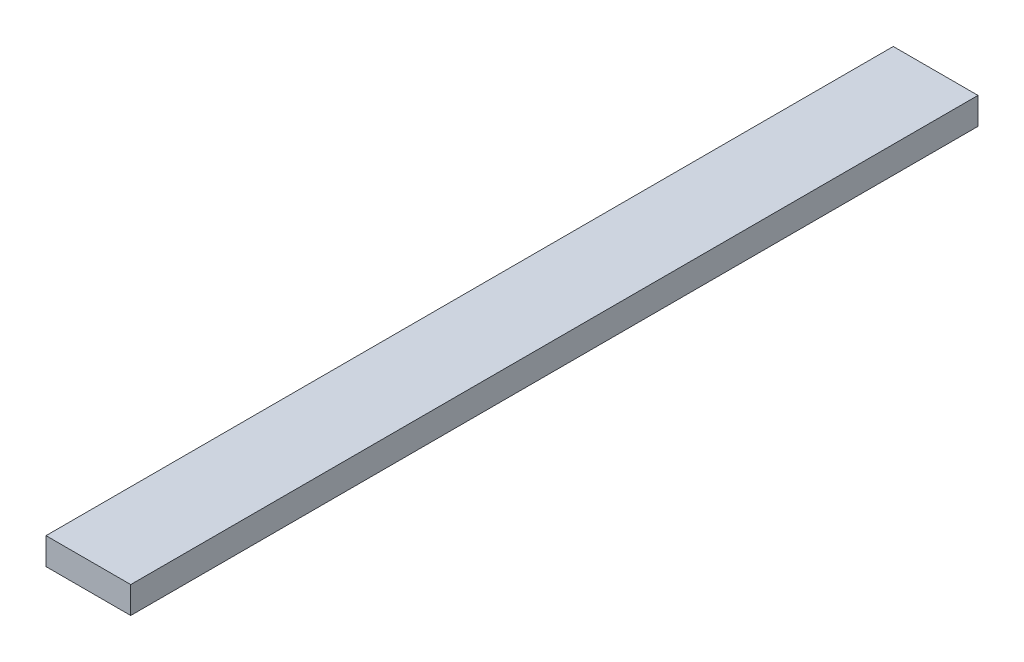
ISO-10303-21;
HEADER;
FILE_DESCRIPTION(('STEP AP214'),'2;1');
FILE_NAME('part.step','',(''),(''),'','','');
FILE_SCHEMA(('AUTOMOTIVE_DESIGN { 1 0 10303 214 1 1 1 1 }'));
ENDSEC;
DATA;
#1=APPLICATION_CONTEXT('core data for automotive mechanical design processes');
#2=APPLICATION_PROTOCOL_DEFINITION('international standard','automotive_design',2000,#1);
#3=PRODUCT_CONTEXT('',#1,'mechanical');
#4=PRODUCT('Part','Part','',(#3));
#5=PRODUCT_RELATED_PRODUCT_CATEGORY('part','',(#4));
#6=PRODUCT_DEFINITION_FORMATION('','',#4);
#7=PRODUCT_DEFINITION_CONTEXT('part definition',#1,'design');
#8=PRODUCT_DEFINITION('design','',#6,#7);
#9=PRODUCT_DEFINITION_SHAPE('','',#8);
#10=(LENGTH_UNIT() NAMED_UNIT(*) SI_UNIT(.MILLI.,.METRE.));
#11=(NAMED_UNIT(*) PLANE_ANGLE_UNIT() SI_UNIT($,.RADIAN.));
#12=(NAMED_UNIT(*) SI_UNIT($,.STERADIAN.) SOLID_ANGLE_UNIT());
#13=UNCERTAINTY_MEASURE_WITH_UNIT(LENGTH_MEASURE(1.E-05),#10,'distance_accuracy_value','');
#14=(GEOMETRIC_REPRESENTATION_CONTEXT(3) GLOBAL_UNCERTAINTY_ASSIGNED_CONTEXT((#13)) GLOBAL_UNIT_ASSIGNED_CONTEXT((#10,
#11,#12)) REPRESENTATION_CONTEXT('',''));
#15=CARTESIAN_POINT('',(0.,0.,0.));
#16=DIRECTION('',(0.,0.,1.));
#17=DIRECTION('',(1.,0.,0.));
#18=AXIS2_PLACEMENT_3D('',#15,#16,#17);
#19=CARTESIAN_POINT('',(0.,0.,600.));
#20=DIRECTION('',(1.,0.,0.));
#21=DIRECTION('',(0.,0.,-1.));
#22=AXIS2_PLACEMENT_3D('',#19,#20,#21);
#23=PLANE('',#22);
#24=DIRECTION('',(0.,-1.,0.));
#25=VECTOR('',#24,1.);
#26=CARTESIAN_POINT('',(0.,0.,0.));
#27=LINE('',#26,#25);
#28=CARTESIAN_POINT('',(0.,19.,0.));
#29=VERTEX_POINT('',#28);
#30=CARTESIAN_POINT('',(0.,0.,0.));
#31=VERTEX_POINT('',#30);
#32=EDGE_CURVE('E96',#29,#31,#27,.T.);
#33=ORIENTED_EDGE('',*,*,#32,.T.);
#34=DIRECTION('',(0.,0.,-1.));
#35=VECTOR('',#34,1.);
#36=CARTESIAN_POINT('',(0.,0.,600.));
#37=LINE('',#36,#35);
#38=CARTESIAN_POINT('',(0.,0.,600.));
#39=VERTEX_POINT('',#38);
#40=EDGE_CURVE('E11',#39,#31,#37,.T.);
#41=ORIENTED_EDGE('',*,*,#40,.F.);
#42=DIRECTION('',(0.,-1.,0.));
#43=VECTOR('',#42,1.);
#44=CARTESIAN_POINT('',(0.,0.,600.));
#45=LINE('',#44,#43);
#46=CARTESIAN_POINT('',(0.,19.,600.));
#47=VERTEX_POINT('',#46);
#48=EDGE_CURVE('E84',#47,#39,#45,.T.);
#49=ORIENTED_EDGE('',*,*,#48,.F.);
#50=DIRECTION('',(0.,0.,-1.));
#51=VECTOR('',#50,1.);
#52=CARTESIAN_POINT('',(0.,19.,600.));
#53=LINE('',#52,#51);
#54=EDGE_CURVE('E92',#47,#29,#53,.T.);
#55=ORIENTED_EDGE('',*,*,#54,.T.);
#56=EDGE_LOOP('',(#33,#41,#49,#55));
#57=FACE_BOUND('',#56,.T.);
#58=ADVANCED_FACE('F33',(#57),#23,.F.);
#59=CARTESIAN_POINT('',(0.,0.,600.));
#60=DIRECTION('',(0.,1.,0.));
#61=DIRECTION('',(0.,0.,1.));
#62=AXIS2_PLACEMENT_3D('',#59,#60,#61);
#63=PLANE('',#62);
#64=CARTESIAN_POINT('',(38.,0.,8.00000000000001));
#65=DIRECTION('',(0.,-1.,0.));
#66=DIRECTION('',(0.,0.,-1.));
#67=AXIS2_PLACEMENT_3D('',#64,#65,#66);
#68=CIRCLE('',#67,2.5);
#69=CARTESIAN_POINT('',(38.,0.,5.50000000000001));
#70=VERTEX_POINT('',#69);
#71=EDGE_CURVE('E116',#70,#70,#68,.T.);
#72=ORIENTED_EDGE('',*,*,#71,.F.);
#73=EDGE_LOOP('',(#72));
#74=FACE_BOUND('',#73,.T.);
#75=CARTESIAN_POINT('',(38.,0.,592.));
#76=DIRECTION('',(0.,-1.,0.));
#77=DIRECTION('',(0.,0.,-1.));
#78=AXIS2_PLACEMENT_3D('',#75,#76,#77);
#79=CIRCLE('',#78,2.5);
#80=CARTESIAN_POINT('',(38.,0.,589.5));
#81=VERTEX_POINT('',#80);
#82=EDGE_CURVE('E110',#81,#81,#79,.T.);
#83=ORIENTED_EDGE('',*,*,#82,.F.);
#84=EDGE_LOOP('',(#83));
#85=FACE_BOUND('',#84,.T.);
#86=DIRECTION('',(1.,0.,0.));
#87=VECTOR('',#86,1.);
#88=CARTESIAN_POINT('',(0.,0.,0.));
#89=LINE('',#88,#87);
#90=CARTESIAN_POINT('',(60.,0.,0.));
#91=VERTEX_POINT('',#90);
#92=EDGE_CURVE('E88',#31,#91,#89,.T.);
#93=ORIENTED_EDGE('',*,*,#92,.T.);
#94=DIRECTION('',(0.,0.,-1.));
#95=VECTOR('',#94,1.);
#96=CARTESIAN_POINT('',(60.,0.,600.));
#97=LINE('',#96,#95);
#98=CARTESIAN_POINT('',(60.,0.,600.));
#99=VERTEX_POINT('',#98);
#100=EDGE_CURVE('E41',#99,#91,#97,.T.);
#101=ORIENTED_EDGE('',*,*,#100,.F.);
#102=DIRECTION('',(1.,0.,0.));
#103=VECTOR('',#102,1.);
#104=CARTESIAN_POINT('',(0.,0.,600.));
#105=LINE('',#104,#103);
#106=EDGE_CURVE('E79',#39,#99,#105,.T.);
#107=ORIENTED_EDGE('',*,*,#106,.F.);
#108=ORIENTED_EDGE('',*,*,#40,.T.);
#109=EDGE_LOOP('',(#93,#101,#107,#108));
#110=FACE_BOUND('',#109,.T.);
#111=ADVANCED_FACE('F87',(#74,#85,#110),#63,.F.);
#112=CARTESIAN_POINT('',(60.,0.,600.));
#113=DIRECTION('',(-1.,0.,0.));
#114=DIRECTION('',(0.,0.,1.));
#115=AXIS2_PLACEMENT_3D('',#112,#113,#114);
#116=PLANE('',#115);
#117=DIRECTION('',(0.,1.,0.));
#118=VECTOR('',#117,1.);
#119=CARTESIAN_POINT('',(60.,0.,0.));
#120=LINE('',#119,#118);
#121=CARTESIAN_POINT('',(60.,19.,0.));
#122=VERTEX_POINT('',#121);
#123=EDGE_CURVE('E66',#91,#122,#120,.T.);
#124=ORIENTED_EDGE('',*,*,#123,.T.);
#125=DIRECTION('',(0.,0.,-1.));
#126=VECTOR('',#125,1.);
#127=CARTESIAN_POINT('',(60.,19.,600.));
#128=LINE('',#127,#126);
#129=CARTESIAN_POINT('',(60.,19.,600.));
#130=VERTEX_POINT('',#129);
#131=EDGE_CURVE('E89',#130,#122,#128,.T.);
#132=ORIENTED_EDGE('',*,*,#131,.F.);
#133=DIRECTION('',(0.,1.,0.));
#134=VECTOR('',#133,1.);
#135=CARTESIAN_POINT('',(60.,0.,600.));
#136=LINE('',#135,#134);
#137=EDGE_CURVE('E82',#99,#130,#136,.T.);
#138=ORIENTED_EDGE('',*,*,#137,.F.);
#139=ORIENTED_EDGE('',*,*,#100,.T.);
#140=EDGE_LOOP('',(#124,#132,#138,#139));
#141=FACE_BOUND('',#140,.T.);
#142=ADVANCED_FACE('F90',(#141),#116,.F.);
#143=CARTESIAN_POINT('',(0.,19.,600.));
#144=DIRECTION('',(0.,-1.,0.));
#145=DIRECTION('',(0.,0.,-1.));
#146=AXIS2_PLACEMENT_3D('',#143,#144,#145);
#147=PLANE('',#146);
#148=DIRECTION('',(-1.,0.,0.));
#149=VECTOR('',#148,1.);
#150=CARTESIAN_POINT('',(0.,19.,0.));
#151=LINE('',#150,#149);
#152=EDGE_CURVE('E72',#122,#29,#151,.T.);
#153=ORIENTED_EDGE('',*,*,#152,.T.);
#154=ORIENTED_EDGE('',*,*,#54,.F.);
#155=DIRECTION('',(-1.,0.,0.));
#156=VECTOR('',#155,1.);
#157=CARTESIAN_POINT('',(0.,19.,600.));
#158=LINE('',#157,#156);
#159=EDGE_CURVE('E49',#130,#47,#158,.T.);
#160=ORIENTED_EDGE('',*,*,#159,.F.);
#161=ORIENTED_EDGE('',*,*,#131,.T.);
#162=EDGE_LOOP('',(#153,#154,#160,#161));
#163=FACE_BOUND('',#162,.T.);
#164=ADVANCED_FACE('F104',(#163),#147,.F.);
#165=CARTESIAN_POINT('',(0.,0.,600.));
#166=DIRECTION('',(0.,0.,-1.));
#167=DIRECTION('',(-1.,0.,0.));
#168=AXIS2_PLACEMENT_3D('',#165,#166,#167);
#169=PLANE('',#168);
#170=ORIENTED_EDGE('',*,*,#48,.T.);
#171=ORIENTED_EDGE('',*,*,#106,.T.);
#172=ORIENTED_EDGE('',*,*,#137,.T.);
#173=ORIENTED_EDGE('',*,*,#159,.T.);
#174=EDGE_LOOP('',(#170,#171,#172,#173));
#175=FACE_BOUND('',#174,.T.);
#176=ADVANCED_FACE('F80',(#175),#169,.F.);
#177=CARTESIAN_POINT('',(0.,0.,0.));
#178=DIRECTION('',(0.,0.,-1.));
#179=DIRECTION('',(-1.,0.,0.));
#180=AXIS2_PLACEMENT_3D('',#177,#178,#179);
#181=PLANE('',#180);
#182=ORIENTED_EDGE('',*,*,#32,.F.);
#183=ORIENTED_EDGE('',*,*,#152,.F.);
#184=ORIENTED_EDGE('',*,*,#123,.F.);
#185=ORIENTED_EDGE('',*,*,#92,.F.);
#186=EDGE_LOOP('',(#182,#183,#184,#185));
#187=FACE_BOUND('',#186,.T.);
#188=ADVANCED_FACE('F107',(#187),#181,.T.);
#189=CARTESIAN_POINT('',(38.,10.,592.));
#190=DIRECTION('',(0.,-1.,0.));
#191=DIRECTION('',(0.,0.,-1.));
#192=AXIS2_PLACEMENT_3D('',#189,#190,#191);
#193=CYLINDRICAL_SURFACE('',#192,2.5);
#194=CARTESIAN_POINT('',(38.,10.,592.));
#195=DIRECTION('',(0.,-1.,0.));
#196=DIRECTION('',(0.,0.,-1.));
#197=AXIS2_PLACEMENT_3D('',#194,#195,#196);
#198=CIRCLE('',#197,2.5);
#199=CARTESIAN_POINT('',(38.,10.,589.5));
#200=VERTEX_POINT('',#199);
#201=EDGE_CURVE('E113',#200,#200,#198,.T.);
#202=ORIENTED_EDGE('',*,*,#201,.F.);
#203=EDGE_LOOP('',(#202));
#204=FACE_BOUND('',#203,.T.);
#205=ORIENTED_EDGE('',*,*,#82,.T.);
#206=EDGE_LOOP('',(#205));
#207=FACE_BOUND('',#206,.T.);
#208=ADVANCED_FACE('F135',(#204,#207),#193,.F.);
#209=CARTESIAN_POINT('',(38.,10.,592.));
#210=DIRECTION('',(0.,-1.,0.));
#211=DIRECTION('',(0.,0.,-1.));
#212=AXIS2_PLACEMENT_3D('',#209,#210,#211);
#213=PLANE('',#212);
#214=ORIENTED_EDGE('',*,*,#201,.T.);
#215=EDGE_LOOP('',(#214));
#216=FACE_BOUND('',#215,.T.);
#217=ADVANCED_FACE('F127',(#216),#213,.T.);
#218=CARTESIAN_POINT('',(38.,10.,8.00000000000001));
#219=DIRECTION('',(0.,-1.,0.));
#220=DIRECTION('',(0.,0.,-1.));
#221=AXIS2_PLACEMENT_3D('',#218,#219,#220);
#222=CYLINDRICAL_SURFACE('',#221,2.5);
#223=CARTESIAN_POINT('',(38.,10.,8.00000000000001));
#224=DIRECTION('',(0.,-1.,0.));
#225=DIRECTION('',(0.,0.,-1.));
#226=AXIS2_PLACEMENT_3D('',#223,#224,#225);
#227=CIRCLE('',#226,2.5);
#228=CARTESIAN_POINT('',(38.,10.,5.50000000000001));
#229=VERTEX_POINT('',#228);
#230=EDGE_CURVE('E99',#229,#229,#227,.T.);
#231=ORIENTED_EDGE('',*,*,#230,.F.);
#232=EDGE_LOOP('',(#231));
#233=FACE_BOUND('',#232,.T.);
#234=ORIENTED_EDGE('',*,*,#71,.T.);
#235=EDGE_LOOP('',(#234));
#236=FACE_BOUND('',#235,.T.);
#237=ADVANCED_FACE('F124',(#233,#236),#222,.F.);
#238=CARTESIAN_POINT('',(38.,10.,8.00000000000001));
#239=DIRECTION('',(0.,-1.,0.));
#240=DIRECTION('',(0.,0.,-1.));
#241=AXIS2_PLACEMENT_3D('',#238,#239,#240);
#242=PLANE('',#241);
#243=ORIENTED_EDGE('',*,*,#230,.T.);
#244=EDGE_LOOP('',(#243));
#245=FACE_BOUND('',#244,.T.);
#246=ADVANCED_FACE('F122',(#245),#242,.T.);
#247=CLOSED_SHELL('',(#58,#111,#142,#164,#176,#188,#208,#217,#237,#246));
#248=MANIFOLD_SOLID_BREP('B2',#247);
#249=ADVANCED_BREP_SHAPE_REPRESENTATION('',(#18,#248),#14);
#250=SHAPE_DEFINITION_REPRESENTATION(#9,#249);
ENDSEC;
END-ISO-10303-21;
